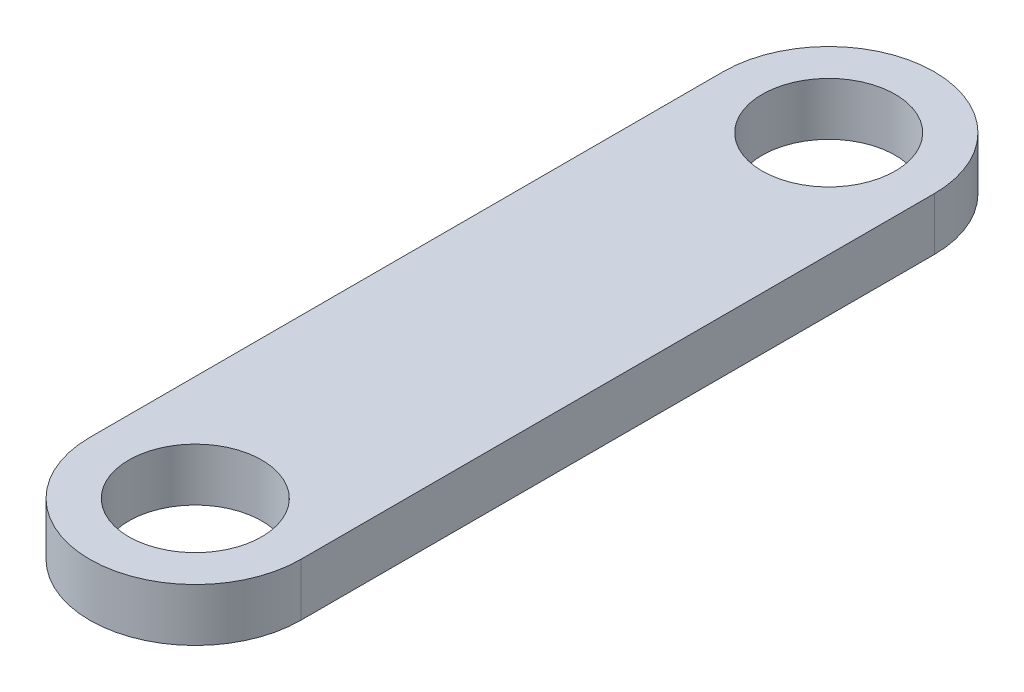
ISO-10303-21;
HEADER;
FILE_DESCRIPTION(('STEP AP214'),'2;1');
FILE_NAME('part.step','',(''),(''),'','','');
FILE_SCHEMA(('AUTOMOTIVE_DESIGN { 1 0 10303 214 1 1 1 1 }'));
ENDSEC;
DATA;
#1=APPLICATION_CONTEXT('core data for automotive mechanical design processes');
#2=APPLICATION_PROTOCOL_DEFINITION('international standard','automotive_design',2000,#1);
#3=PRODUCT_CONTEXT('',#1,'mechanical');
#4=PRODUCT('Part','Part','',(#3));
#5=PRODUCT_RELATED_PRODUCT_CATEGORY('part','',(#4));
#6=PRODUCT_DEFINITION_FORMATION('','',#4);
#7=PRODUCT_DEFINITION_CONTEXT('part definition',#1,'design');
#8=PRODUCT_DEFINITION('design','',#6,#7);
#9=PRODUCT_DEFINITION_SHAPE('','',#8);
#10=(LENGTH_UNIT() NAMED_UNIT(*) SI_UNIT(.MILLI.,.METRE.));
#11=(NAMED_UNIT(*) PLANE_ANGLE_UNIT() SI_UNIT($,.RADIAN.));
#12=(NAMED_UNIT(*) SI_UNIT($,.STERADIAN.) SOLID_ANGLE_UNIT());
#13=UNCERTAINTY_MEASURE_WITH_UNIT(LENGTH_MEASURE(1.E-05),#10,'distance_accuracy_value','');
#14=(GEOMETRIC_REPRESENTATION_CONTEXT(3) GLOBAL_UNCERTAINTY_ASSIGNED_CONTEXT((#13)) GLOBAL_UNIT_ASSIGNED_CONTEXT((#10,
#11,#12)) REPRESENTATION_CONTEXT('',''));
#15=CARTESIAN_POINT('',(0.,0.,0.));
#16=DIRECTION('',(0.,0.,1.));
#17=DIRECTION('',(1.,0.,0.));
#18=AXIS2_PLACEMENT_3D('',#15,#16,#17);
#19=CARTESIAN_POINT('',(0.,-1.5875,19.05));
#20=DIRECTION('',(0.,1.,0.));
#21=DIRECTION('',(0.,0.,1.));
#22=AXIS2_PLACEMENT_3D('',#19,#20,#21);
#23=CYLINDRICAL_SURFACE('',#22,3.175);
#24=CARTESIAN_POINT('',(0.,0.,19.05));
#25=DIRECTION('',(0.,1.,0.));
#26=DIRECTION('',(0.,0.,-1.));
#27=AXIS2_PLACEMENT_3D('',#24,#25,#26);
#28=CIRCLE('',#27,3.175);
#29=CARTESIAN_POINT('',(-3.175,0.,19.05));
#30=VERTEX_POINT('',#29);
#31=CARTESIAN_POINT('',(3.175,0.,19.05));
#32=VERTEX_POINT('',#31);
#33=EDGE_CURVE('E110',#30,#32,#28,.T.);
#34=ORIENTED_EDGE('',*,*,#33,.F.);
#35=DIRECTION('',(0.,1.,0.));
#36=VECTOR('',#35,1.);
#37=CARTESIAN_POINT('',(-3.175,-1.5875,19.05));
#38=LINE('',#37,#36);
#39=CARTESIAN_POINT('',(-3.175,-1.5875,19.05));
#40=VERTEX_POINT('',#39);
#41=EDGE_CURVE('E11',#40,#30,#38,.T.);
#42=ORIENTED_EDGE('',*,*,#41,.F.);
#43=CARTESIAN_POINT('',(0.,-1.5875,19.05));
#44=DIRECTION('',(0.,1.,0.));
#45=DIRECTION('',(0.,0.,-1.));
#46=AXIS2_PLACEMENT_3D('',#43,#44,#45);
#47=CIRCLE('',#46,3.175);
#48=CARTESIAN_POINT('',(3.175,-1.5875,19.05));
#49=VERTEX_POINT('',#48);
#50=EDGE_CURVE('E101',#40,#49,#47,.T.);
#51=ORIENTED_EDGE('',*,*,#50,.T.);
#52=DIRECTION('',(0.,1.,0.));
#53=VECTOR('',#52,1.);
#54=CARTESIAN_POINT('',(3.175,-1.5875,19.05));
#55=LINE('',#54,#53);
#56=EDGE_CURVE('E42',#49,#32,#55,.T.);
#57=ORIENTED_EDGE('',*,*,#56,.T.);
#58=EDGE_LOOP('',(#34,#42,#51,#57));
#59=FACE_BOUND('',#58,.T.);
#60=ADVANCED_FACE('F39',(#59),#23,.T.);
#61=CARTESIAN_POINT('',(-3.175,-1.5875,19.05));
#62=DIRECTION('',(-1.,0.,0.));
#63=DIRECTION('',(0.,0.,1.));
#64=AXIS2_PLACEMENT_3D('',#61,#62,#63);
#65=PLANE('',#64);
#66=DIRECTION('',(0.,0.,1.));
#67=VECTOR('',#66,1.);
#68=CARTESIAN_POINT('',(-3.175,0.,19.05));
#69=LINE('',#68,#67);
#70=CARTESIAN_POINT('',(-3.175,0.,0.));
#71=VERTEX_POINT('',#70);
#72=EDGE_CURVE('E104',#71,#30,#69,.T.);
#73=ORIENTED_EDGE('',*,*,#72,.F.);
#74=DIRECTION('',(0.,1.,0.));
#75=VECTOR('',#74,1.);
#76=CARTESIAN_POINT('',(-3.175,-1.5875,0.));
#77=LINE('',#76,#75);
#78=CARTESIAN_POINT('',(-3.175,-1.5875,0.));
#79=VERTEX_POINT('',#78);
#80=EDGE_CURVE('E49',#79,#71,#77,.T.);
#81=ORIENTED_EDGE('',*,*,#80,.F.);
#82=DIRECTION('',(0.,0.,1.));
#83=VECTOR('',#82,1.);
#84=CARTESIAN_POINT('',(-3.175,-1.5875,19.05));
#85=LINE('',#84,#83);
#86=EDGE_CURVE('E96',#79,#40,#85,.T.);
#87=ORIENTED_EDGE('',*,*,#86,.T.);
#88=ORIENTED_EDGE('',*,*,#41,.T.);
#89=EDGE_LOOP('',(#73,#81,#87,#88));
#90=FACE_BOUND('',#89,.T.);
#91=ADVANCED_FACE('F127',(#90),#65,.T.);
#92=CARTESIAN_POINT('',(0.,-1.5875,0.));
#93=DIRECTION('',(0.,1.,0.));
#94=DIRECTION('',(0.,0.,1.));
#95=AXIS2_PLACEMENT_3D('',#92,#93,#94);
#96=CYLINDRICAL_SURFACE('',#95,3.175);
#97=CARTESIAN_POINT('',(0.,0.,0.));
#98=DIRECTION('',(0.,1.,0.));
#99=DIRECTION('',(0.,0.,1.));
#100=AXIS2_PLACEMENT_3D('',#97,#98,#99);
#101=CIRCLE('',#100,3.175);
#102=CARTESIAN_POINT('',(3.175,0.,0.));
#103=VERTEX_POINT('',#102);
#104=EDGE_CURVE('E90',#103,#71,#101,.T.);
#105=ORIENTED_EDGE('',*,*,#104,.F.);
#106=DIRECTION('',(0.,1.,0.));
#107=VECTOR('',#106,1.);
#108=CARTESIAN_POINT('',(3.175,-1.5875,0.));
#109=LINE('',#108,#107);
#110=CARTESIAN_POINT('',(3.175,-1.5875,0.));
#111=VERTEX_POINT('',#110);
#112=EDGE_CURVE('E85',#111,#103,#109,.T.);
#113=ORIENTED_EDGE('',*,*,#112,.F.);
#114=CARTESIAN_POINT('',(0.,-1.5875,0.));
#115=DIRECTION('',(0.,1.,0.));
#116=DIRECTION('',(0.,0.,1.));
#117=AXIS2_PLACEMENT_3D('',#114,#115,#116);
#118=CIRCLE('',#117,3.175);
#119=EDGE_CURVE('E88',#111,#79,#118,.T.);
#120=ORIENTED_EDGE('',*,*,#119,.T.);
#121=ORIENTED_EDGE('',*,*,#80,.T.);
#122=EDGE_LOOP('',(#105,#113,#120,#121));
#123=FACE_BOUND('',#122,.T.);
#124=ADVANCED_FACE('F87',(#123),#96,.T.);
#125=CARTESIAN_POINT('',(3.175,-1.5875,19.05));
#126=DIRECTION('',(1.,0.,0.));
#127=DIRECTION('',(0.,0.,-1.));
#128=AXIS2_PLACEMENT_3D('',#125,#126,#127);
#129=PLANE('',#128);
#130=DIRECTION('',(0.,0.,-1.));
#131=VECTOR('',#130,1.);
#132=CARTESIAN_POINT('',(3.175,0.,19.05));
#133=LINE('',#132,#131);
#134=EDGE_CURVE('E114',#32,#103,#133,.T.);
#135=ORIENTED_EDGE('',*,*,#134,.F.);
#136=ORIENTED_EDGE('',*,*,#56,.F.);
#137=DIRECTION('',(0.,0.,-1.));
#138=VECTOR('',#137,1.);
#139=CARTESIAN_POINT('',(3.175,-1.5875,19.05));
#140=LINE('',#139,#138);
#141=EDGE_CURVE('E95',#49,#111,#140,.T.);
#142=ORIENTED_EDGE('',*,*,#141,.T.);
#143=ORIENTED_EDGE('',*,*,#112,.T.);
#144=EDGE_LOOP('',(#135,#136,#142,#143));
#145=FACE_BOUND('',#144,.T.);
#146=ADVANCED_FACE('F99',(#145),#129,.T.);
#147=CARTESIAN_POINT('',(0.,-1.5875,19.05));
#148=DIRECTION('',(0.,-1.,0.));
#149=DIRECTION('',(0.,0.,-1.));
#150=AXIS2_PLACEMENT_3D('',#147,#148,#149);
#151=PLANE('',#150);
#152=CARTESIAN_POINT('',(0.,-1.5875,19.05));
#153=DIRECTION('',(0.,1.,0.));
#154=DIRECTION('',(0.,0.,1.));
#155=AXIS2_PLACEMENT_3D('',#152,#153,#154);
#156=CIRCLE('',#155,2.);
#157=CARTESIAN_POINT('',(0.,-1.5875,21.05));
#158=VERTEX_POINT('',#157);
#159=EDGE_CURVE('E160',#158,#158,#156,.T.);
#160=ORIENTED_EDGE('',*,*,#159,.T.);
#161=EDGE_LOOP('',(#160));
#162=FACE_BOUND('',#161,.T.);
#163=CARTESIAN_POINT('',(0.,-1.5875,0.));
#164=DIRECTION('',(0.,1.,0.));
#165=DIRECTION('',(0.,0.,1.));
#166=AXIS2_PLACEMENT_3D('',#163,#164,#165);
#167=CIRCLE('',#166,2.);
#168=CARTESIAN_POINT('',(0.,-1.5875,2.));
#169=VERTEX_POINT('',#168);
#170=EDGE_CURVE('E115',#169,#169,#167,.T.);
#171=ORIENTED_EDGE('',*,*,#170,.T.);
#172=EDGE_LOOP('',(#171));
#173=FACE_BOUND('',#172,.T.);
#174=ORIENTED_EDGE('',*,*,#50,.F.);
#175=ORIENTED_EDGE('',*,*,#86,.F.);
#176=ORIENTED_EDGE('',*,*,#119,.F.);
#177=ORIENTED_EDGE('',*,*,#141,.F.);
#178=EDGE_LOOP('',(#174,#175,#176,#177));
#179=FACE_BOUND('',#178,.T.);
#180=ADVANCED_FACE('F94',(#162,#173,#179),#151,.T.);
#181=CARTESIAN_POINT('',(0.,0.,19.05));
#182=DIRECTION('',(0.,-1.,0.));
#183=DIRECTION('',(0.,0.,-1.));
#184=AXIS2_PLACEMENT_3D('',#181,#182,#183);
#185=PLANE('',#184);
#186=CARTESIAN_POINT('',(0.,0.,19.05));
#187=DIRECTION('',(0.,1.,0.));
#188=DIRECTION('',(0.,0.,1.));
#189=AXIS2_PLACEMENT_3D('',#186,#187,#188);
#190=CIRCLE('',#189,2.);
#191=CARTESIAN_POINT('',(0.,0.,21.05));
#192=VERTEX_POINT('',#191);
#193=EDGE_CURVE('E163',#192,#192,#190,.T.);
#194=ORIENTED_EDGE('',*,*,#193,.F.);
#195=EDGE_LOOP('',(#194));
#196=FACE_BOUND('',#195,.T.);
#197=CARTESIAN_POINT('',(0.,0.,0.));
#198=DIRECTION('',(0.,1.,0.));
#199=DIRECTION('',(0.,0.,1.));
#200=AXIS2_PLACEMENT_3D('',#197,#198,#199);
#201=CIRCLE('',#200,2.);
#202=CARTESIAN_POINT('',(0.,0.,2.));
#203=VERTEX_POINT('',#202);
#204=EDGE_CURVE('E167',#203,#203,#201,.T.);
#205=ORIENTED_EDGE('',*,*,#204,.F.);
#206=EDGE_LOOP('',(#205));
#207=FACE_BOUND('',#206,.T.);
#208=ORIENTED_EDGE('',*,*,#33,.T.);
#209=ORIENTED_EDGE('',*,*,#134,.T.);
#210=ORIENTED_EDGE('',*,*,#104,.T.);
#211=ORIENTED_EDGE('',*,*,#72,.T.);
#212=EDGE_LOOP('',(#208,#209,#210,#211));
#213=FACE_BOUND('',#212,.T.);
#214=ADVANCED_FACE('F126',(#196,#207,#213),#185,.F.);
#215=CARTESIAN_POINT('',(0.,-1.5875,0.));
#216=DIRECTION('',(0.,1.,0.));
#217=DIRECTION('',(0.,0.,1.));
#218=AXIS2_PLACEMENT_3D('',#215,#216,#217);
#219=CYLINDRICAL_SURFACE('',#218,2.);
#220=ORIENTED_EDGE('',*,*,#170,.F.);
#221=EDGE_LOOP('',(#220));
#222=FACE_BOUND('',#221,.T.);
#223=ORIENTED_EDGE('',*,*,#204,.T.);
#224=EDGE_LOOP('',(#223));
#225=FACE_BOUND('',#224,.T.);
#226=ADVANCED_FACE('F145',(#222,#225),#219,.F.);
#227=CARTESIAN_POINT('',(0.,-1.5875,19.05));
#228=DIRECTION('',(0.,1.,0.));
#229=DIRECTION('',(0.,0.,1.));
#230=AXIS2_PLACEMENT_3D('',#227,#228,#229);
#231=CYLINDRICAL_SURFACE('',#230,2.);
#232=ORIENTED_EDGE('',*,*,#159,.F.);
#233=EDGE_LOOP('',(#232));
#234=FACE_BOUND('',#233,.T.);
#235=ORIENTED_EDGE('',*,*,#193,.T.);
#236=EDGE_LOOP('',(#235));
#237=FACE_BOUND('',#236,.T.);
#238=ADVANCED_FACE('F152',(#234,#237),#231,.F.);
#239=CLOSED_SHELL('',(#60,#91,#124,#146,#180,#214,#226,#238));
#240=MANIFOLD_SOLID_BREP('B2',#239);
#241=ADVANCED_BREP_SHAPE_REPRESENTATION('',(#18,#240),#14);
#242=SHAPE_DEFINITION_REPRESENTATION(#9,#241);
ENDSEC;
END-ISO-10303-21;
